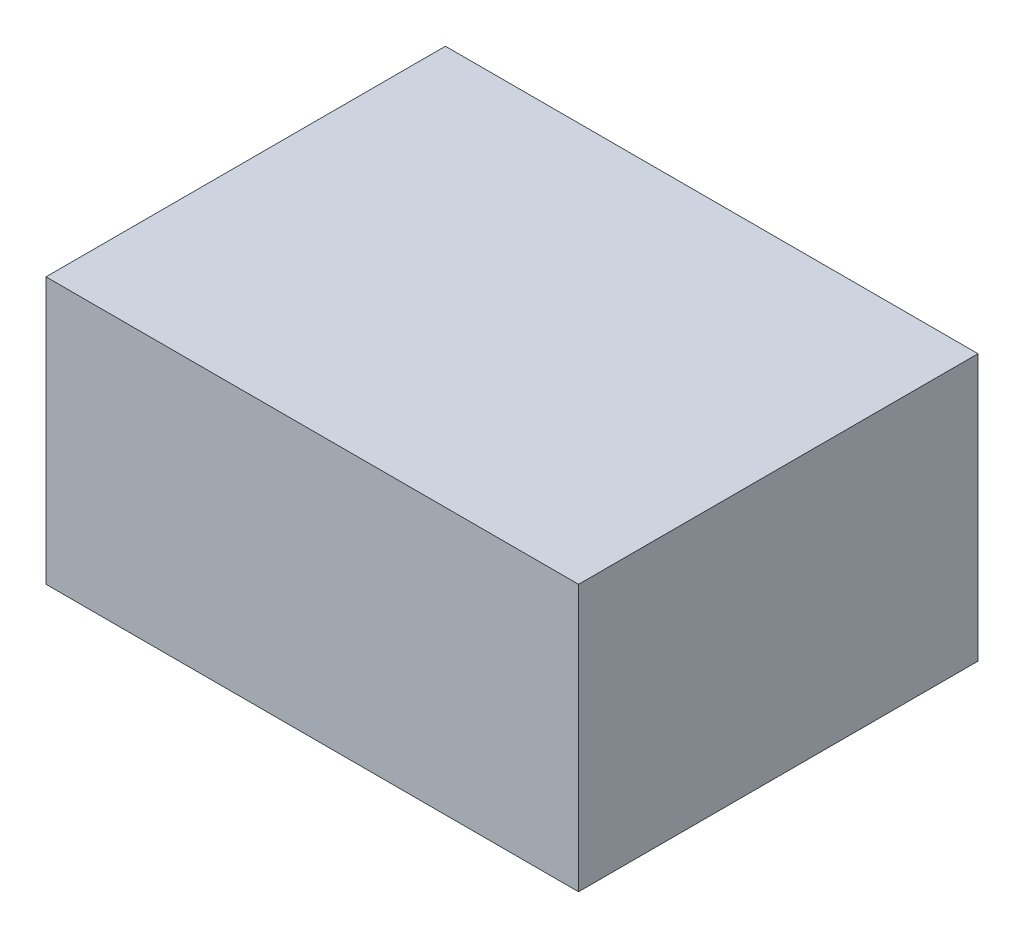
ISO-10303-21;
HEADER;
FILE_DESCRIPTION(('STEP AP214'),'2;1');
FILE_NAME('part.step','',(''),(''),'','','');
FILE_SCHEMA(('AUTOMOTIVE_DESIGN { 1 0 10303 214 1 1 1 1 }'));
ENDSEC;
DATA;
#1=APPLICATION_CONTEXT('core data for automotive mechanical design processes');
#2=APPLICATION_PROTOCOL_DEFINITION('international standard','automotive_design',2000,#1);
#3=PRODUCT_CONTEXT('',#1,'mechanical');
#4=PRODUCT('Part','Part','',(#3));
#5=PRODUCT_RELATED_PRODUCT_CATEGORY('part','',(#4));
#6=PRODUCT_DEFINITION_FORMATION('','',#4);
#7=PRODUCT_DEFINITION_CONTEXT('part definition',#1,'design');
#8=PRODUCT_DEFINITION('design','',#6,#7);
#9=PRODUCT_DEFINITION_SHAPE('','',#8);
#10=(LENGTH_UNIT() NAMED_UNIT(*) SI_UNIT(.MILLI.,.METRE.));
#11=(NAMED_UNIT(*) PLANE_ANGLE_UNIT() SI_UNIT($,.RADIAN.));
#12=(NAMED_UNIT(*) SI_UNIT($,.STERADIAN.) SOLID_ANGLE_UNIT());
#13=UNCERTAINTY_MEASURE_WITH_UNIT(LENGTH_MEASURE(1.E-05),#10,'distance_accuracy_value','');
#14=(GEOMETRIC_REPRESENTATION_CONTEXT(3) GLOBAL_UNCERTAINTY_ASSIGNED_CONTEXT((#13)) GLOBAL_UNIT_ASSIGNED_CONTEXT((#10,
#11,#12)) REPRESENTATION_CONTEXT('',''));
#15=CARTESIAN_POINT('',(0.,0.,0.));
#16=DIRECTION('',(0.,0.,1.));
#17=DIRECTION('',(1.,0.,0.));
#18=AXIS2_PLACEMENT_3D('',#15,#16,#17);
#19=CARTESIAN_POINT('',(-60.,30.,-45.));
#20=DIRECTION('',(1.,0.,0.));
#21=DIRECTION('',(0.,0.,-1.));
#22=AXIS2_PLACEMENT_3D('',#19,#20,#21);
#23=PLANE('',#22);
#24=DIRECTION('',(0.,0.,1.));
#25=VECTOR('',#24,1.);
#26=CARTESIAN_POINT('',(-60.,0.,-45.));
#27=LINE('',#26,#25);
#28=CARTESIAN_POINT('',(-60.,0.,-45.));
#29=VERTEX_POINT('',#28);
#30=CARTESIAN_POINT('',(-60.,0.,0.));
#31=VERTEX_POINT('',#30);
#32=EDGE_CURVE('E243',#29,#31,#27,.T.);
#33=ORIENTED_EDGE('',*,*,#32,.T.);
#34=DIRECTION('',(0.,-1.,0.));
#35=VECTOR('',#34,1.);
#36=CARTESIAN_POINT('',(-60.,30.,0.));
#37=LINE('',#36,#35);
#38=CARTESIAN_POINT('',(-60.,30.,0.));
#39=VERTEX_POINT('',#38);
#40=EDGE_CURVE('E308',#39,#31,#37,.T.);
#41=ORIENTED_EDGE('',*,*,#40,.F.);
#42=DIRECTION('',(0.,0.,1.));
#43=VECTOR('',#42,1.);
#44=CARTESIAN_POINT('',(-60.,30.,-45.));
#45=LINE('',#44,#43);
#46=CARTESIAN_POINT('',(-60.,30.,-45.));
#47=VERTEX_POINT('',#46);
#48=EDGE_CURVE('E270',#47,#39,#45,.T.);
#49=ORIENTED_EDGE('',*,*,#48,.F.);
#50=DIRECTION('',(0.,-1.,0.));
#51=VECTOR('',#50,1.);
#52=CARTESIAN_POINT('',(-60.,30.,-45.));
#53=LINE('',#52,#51);
#54=EDGE_CURVE('E284',#47,#29,#53,.T.);
#55=ORIENTED_EDGE('',*,*,#54,.T.);
#56=EDGE_LOOP('',(#33,#41,#49,#55));
#57=FACE_BOUND('',#56,.T.);
#58=ADVANCED_FACE('F38',(#57),#23,.F.);
#59=CARTESIAN_POINT('',(-60.,30.,0.));
#60=DIRECTION('',(0.,0.,-1.));
#61=DIRECTION('',(-1.,0.,0.));
#62=AXIS2_PLACEMENT_3D('',#59,#60,#61);
#63=PLANE('',#62);
#64=DIRECTION('',(1.,0.,0.));
#65=VECTOR('',#64,1.);
#66=CARTESIAN_POINT('',(-60.,0.,0.));
#67=LINE('',#66,#65);
#68=CARTESIAN_POINT('',(0.,0.,0.));
#69=VERTEX_POINT('',#68);
#70=EDGE_CURVE('E288',#31,#69,#67,.T.);
#71=ORIENTED_EDGE('',*,*,#70,.T.);
#72=DIRECTION('',(0.,-1.,0.));
#73=VECTOR('',#72,1.);
#74=CARTESIAN_POINT('',(0.,30.,0.));
#75=LINE('',#74,#73);
#76=CARTESIAN_POINT('',(0.,30.,0.));
#77=VERTEX_POINT('',#76);
#78=EDGE_CURVE('E304',#77,#69,#75,.T.);
#79=ORIENTED_EDGE('',*,*,#78,.F.);
#80=DIRECTION('',(1.,0.,0.));
#81=VECTOR('',#80,1.);
#82=CARTESIAN_POINT('',(-60.,30.,0.));
#83=LINE('',#82,#81);
#84=EDGE_CURVE('E274',#39,#77,#83,.T.);
#85=ORIENTED_EDGE('',*,*,#84,.F.);
#86=ORIENTED_EDGE('',*,*,#40,.T.);
#87=EDGE_LOOP('',(#71,#79,#85,#86));
#88=FACE_BOUND('',#87,.T.);
#89=ADVANCED_FACE('F525',(#88),#63,.F.);
#90=CARTESIAN_POINT('',(0.,30.,-45.));
#91=DIRECTION('',(-1.,0.,0.));
#92=DIRECTION('',(0.,0.,1.));
#93=AXIS2_PLACEMENT_3D('',#90,#91,#92);
#94=PLANE('',#93);
#95=DIRECTION('',(0.,0.,-1.));
#96=VECTOR('',#95,1.);
#97=CARTESIAN_POINT('',(0.,0.,-45.));
#98=LINE('',#97,#96);
#99=CARTESIAN_POINT('',(0.,0.,-45.));
#100=VERTEX_POINT('',#99);
#101=EDGE_CURVE('E291',#69,#100,#98,.T.);
#102=ORIENTED_EDGE('',*,*,#101,.T.);
#103=DIRECTION('',(0.,-1.,0.));
#104=VECTOR('',#103,1.);
#105=CARTESIAN_POINT('',(0.,30.,-45.));
#106=LINE('',#105,#104);
#107=CARTESIAN_POINT('',(0.,30.,-45.));
#108=VERTEX_POINT('',#107);
#109=EDGE_CURVE('E300',#108,#100,#106,.T.);
#110=ORIENTED_EDGE('',*,*,#109,.F.);
#111=DIRECTION('',(0.,0.,-1.));
#112=VECTOR('',#111,1.);
#113=CARTESIAN_POINT('',(0.,30.,-45.));
#114=LINE('',#113,#112);
#115=EDGE_CURVE('E278',#77,#108,#114,.T.);
#116=ORIENTED_EDGE('',*,*,#115,.F.);
#117=ORIENTED_EDGE('',*,*,#78,.T.);
#118=EDGE_LOOP('',(#102,#110,#116,#117));
#119=FACE_BOUND('',#118,.T.);
#120=ADVANCED_FACE('F531',(#119),#94,.F.);
#121=CARTESIAN_POINT('',(-60.,30.,-45.));
#122=DIRECTION('',(0.,0.,1.));
#123=DIRECTION('',(1.,0.,0.));
#124=AXIS2_PLACEMENT_3D('',#121,#122,#123);
#125=PLANE('',#124);
#126=DIRECTION('',(-1.,0.,0.));
#127=VECTOR('',#126,1.);
#128=CARTESIAN_POINT('',(-60.,0.,-45.));
#129=LINE('',#128,#127);
#130=CARTESIAN_POINT('',(-12.7,0.,-45.));
#131=VERTEX_POINT('',#130);
#132=EDGE_CURVE('E275',#100,#131,#129,.T.);
#133=ORIENTED_EDGE('',*,*,#132,.T.);
#134=CARTESIAN_POINT('',(-34.0331381050122,-5.37561332244758,-45.));
#135=DIRECTION('',(0.,0.,-1.));
#136=DIRECTION('',(-1.,0.,0.));
#137=AXIS2_PLACEMENT_3D('',#134,#135,#136);
#138=CIRCLE('',#137,22.);
#139=CARTESIAN_POINT('',(-47.430644896312,12.0745102237361,-45.));
#140=VERTEX_POINT('',#139);
#141=EDGE_CURVE('E457',#140,#131,#138,.T.);
#142=ORIENTED_EDGE('',*,*,#141,.F.);
#143=CARTESIAN_POINT('',(-45.2992233613325,9.29835420502508,-45.));
#144=DIRECTION('',(0.,0.,-1.));
#145=DIRECTION('',(-1.,0.,0.));
#146=AXIS2_PLACEMENT_3D('',#143,#144,#145);
#147=CIRCLE('',#146,3.5);
#148=CARTESIAN_POINT('',(-43.8119129602392,6.13008846951621,-45.));
#149=VERTEX_POINT('',#148);
#150=EDGE_CURVE('E824',#149,#140,#147,.T.);
#151=ORIENTED_EDGE('',*,*,#150,.F.);
#152=CARTESIAN_POINT('',(-39.383580329191,-3.30313712352215,-45.));
#153=DIRECTION('',(0.,0.,1.));
#154=DIRECTION('',(1.,0.,0.));
#155=AXIS2_PLACEMENT_3D('',#152,#153,#154);
#156=CIRCLE('',#155,10.4209344581165);
#157=CARTESIAN_POINT('',(-29.5,0.,-45.));
#158=VERTEX_POINT('',#157);
#159=EDGE_CURVE('E821',#158,#149,#156,.T.);
#160=ORIENTED_EDGE('',*,*,#159,.F.);
#161=EDGE_CURVE('E229',#158,#29,#129,.T.);
#162=ORIENTED_EDGE('',*,*,#161,.T.);
#163=ORIENTED_EDGE('',*,*,#54,.F.);
#164=DIRECTION('',(-1.,0.,0.));
#165=VECTOR('',#164,1.);
#166=CARTESIAN_POINT('',(-60.,30.,-45.));
#167=LINE('',#166,#165);
#168=EDGE_CURVE('E281',#108,#47,#167,.T.);
#169=ORIENTED_EDGE('',*,*,#168,.F.);
#170=ORIENTED_EDGE('',*,*,#109,.T.);
#171=EDGE_LOOP('',(#133,#142,#151,#160,#162,#163,#169,#170));
#172=FACE_BOUND('',#171,.T.);
#173=ADVANCED_FACE('F749',(#172),#125,.F.);
#174=CARTESIAN_POINT('',(0.,30.,0.));
#175=DIRECTION('',(0.,1.,0.));
#176=DIRECTION('',(0.,0.,1.));
#177=AXIS2_PLACEMENT_3D('',#174,#175,#176);
#178=PLANE('',#177);
#179=ORIENTED_EDGE('',*,*,#48,.T.);
#180=ORIENTED_EDGE('',*,*,#84,.T.);
#181=ORIENTED_EDGE('',*,*,#115,.T.);
#182=ORIENTED_EDGE('',*,*,#168,.T.);
#183=EDGE_LOOP('',(#179,#180,#181,#182));
#184=FACE_BOUND('',#183,.T.);
#185=ADVANCED_FACE('F738',(#184),#178,.T.);
#186=CARTESIAN_POINT('',(0.,0.,0.));
#187=DIRECTION('',(0.,1.,0.));
#188=DIRECTION('',(0.,0.,1.));
#189=AXIS2_PLACEMENT_3D('',#186,#187,#188);
#190=PLANE('',#189);
#191=DIRECTION('',(0.,0.,1.));
#192=VECTOR('',#191,1.);
#193=CARTESIAN_POINT('',(-19.,0.,0.));
#194=LINE('',#193,#192);
#195=CARTESIAN_POINT('',(-19.,0.,-32.));
#196=VERTEX_POINT('',#195);
#197=CARTESIAN_POINT('',(-19.,0.,-9.99999999999998));
#198=VERTEX_POINT('',#197);
#199=EDGE_CURVE('E413',#196,#198,#194,.T.);
#200=ORIENTED_EDGE('',*,*,#199,.T.);
#201=DIRECTION('',(1.,0.,0.));
#202=VECTOR('',#201,1.);
#203=CARTESIAN_POINT('',(0.,0.,-9.99999999999998));
#204=LINE('',#203,#202);
#205=CARTESIAN_POINT('',(-6.49999999999999,0.,-9.99999999999998));
#206=VERTEX_POINT('',#205);
#207=EDGE_CURVE('E422',#198,#206,#204,.T.);
#208=ORIENTED_EDGE('',*,*,#207,.T.);
#209=DIRECTION('',(0.,0.,-1.));
#210=VECTOR('',#209,1.);
#211=CARTESIAN_POINT('',(-6.49999999999999,0.,0.));
#212=LINE('',#211,#210);
#213=CARTESIAN_POINT('',(-6.49999999999998,0.,-32.));
#214=VERTEX_POINT('',#213);
#215=EDGE_CURVE('E419',#206,#214,#212,.T.);
#216=ORIENTED_EDGE('',*,*,#215,.T.);
#217=DIRECTION('',(-1.,0.,0.));
#218=VECTOR('',#217,1.);
#219=CARTESIAN_POINT('',(0.,0.,-32.));
#220=LINE('',#219,#218);
#221=EDGE_CURVE('E416',#214,#196,#220,.T.);
#222=ORIENTED_EDGE('',*,*,#221,.T.);
#223=EDGE_LOOP('',(#200,#208,#216,#222));
#224=FACE_BOUND('',#223,.T.);
#225=DIRECTION('',(0.,0.,-1.));
#226=VECTOR('',#225,1.);
#227=CARTESIAN_POINT('',(-41.5,0.,0.));
#228=LINE('',#227,#226);
#229=CARTESIAN_POINT('',(-41.5,0.,-9.99999999999999));
#230=VERTEX_POINT('',#229);
#231=CARTESIAN_POINT('',(-41.5,0.,-32.));
#232=VERTEX_POINT('',#231);
#233=EDGE_CURVE('E406',#230,#232,#228,.T.);
#234=ORIENTED_EDGE('',*,*,#233,.T.);
#235=DIRECTION('',(-1.,0.,0.));
#236=VECTOR('',#235,1.);
#237=CARTESIAN_POINT('',(0.,0.,-32.0000000000001));
#238=LINE('',#237,#236);
#239=CARTESIAN_POINT('',(-54.,0.,-32.));
#240=VERTEX_POINT('',#239);
#241=EDGE_CURVE('E409',#232,#240,#238,.T.);
#242=ORIENTED_EDGE('',*,*,#241,.T.);
#243=DIRECTION('',(0.,0.,1.));
#244=VECTOR('',#243,1.);
#245=CARTESIAN_POINT('',(-54.,0.,0.));
#246=LINE('',#245,#244);
#247=CARTESIAN_POINT('',(-54.,0.,-9.99999999999997));
#248=VERTEX_POINT('',#247);
#249=EDGE_CURVE('E400',#240,#248,#246,.T.);
#250=ORIENTED_EDGE('',*,*,#249,.T.);
#251=DIRECTION('',(1.,0.,0.));
#252=VECTOR('',#251,1.);
#253=CARTESIAN_POINT('',(0.,0.,-10.0000000000001));
#254=LINE('',#253,#252);
#255=EDGE_CURVE('E403',#248,#230,#254,.T.);
#256=ORIENTED_EDGE('',*,*,#255,.T.);
#257=EDGE_LOOP('',(#234,#242,#250,#256));
#258=FACE_BOUND('',#257,.T.);
#259=DIRECTION('',(-1.,0.,0.));
#260=VECTOR('',#259,1.);
#261=CARTESIAN_POINT('',(-12.7,0.,-35.));
#262=LINE('',#261,#260);
#263=CARTESIAN_POINT('',(-12.7,0.,-35.));
#264=VERTEX_POINT('',#263);
#265=CARTESIAN_POINT('',(-29.5,0.,-35.));
#266=VERTEX_POINT('',#265);
#267=EDGE_CURVE('E215',#264,#266,#262,.T.);
#268=ORIENTED_EDGE('',*,*,#267,.F.);
#269=DIRECTION('',(0.,0.,-1.));
#270=VECTOR('',#269,1.);
#271=CARTESIAN_POINT('',(-12.7,0.,-35.));
#272=LINE('',#271,#270);
#273=EDGE_CURVE('E231',#264,#131,#272,.T.);
#274=ORIENTED_EDGE('',*,*,#273,.T.);
#275=ORIENTED_EDGE('',*,*,#132,.F.);
#276=ORIENTED_EDGE('',*,*,#101,.F.);
#277=ORIENTED_EDGE('',*,*,#70,.F.);
#278=ORIENTED_EDGE('',*,*,#32,.F.);
#279=ORIENTED_EDGE('',*,*,#161,.F.);
#280=DIRECTION('',(0.,0.,-1.));
#281=VECTOR('',#280,1.);
#282=CARTESIAN_POINT('',(-29.5,0.,-35.));
#283=LINE('',#282,#281);
#284=EDGE_CURVE('E207',#266,#158,#283,.T.);
#285=ORIENTED_EDGE('',*,*,#284,.F.);
#286=EDGE_LOOP('',(#268,#274,#275,#276,#277,#278,#279,#285));
#287=FACE_BOUND('',#286,.T.);
#288=ADVANCED_FACE('F227',(#224,#258,#287),#190,.F.);
#289=CARTESIAN_POINT('',(-16.,20.,-13.));
#290=DIRECTION('',(-1.,0.,0.));
#291=DIRECTION('',(0.,0.,1.));
#292=AXIS2_PLACEMENT_3D('',#289,#290,#291);
#293=PLANE('',#292);
#294=DIRECTION('',(0.,-1.,0.));
#295=VECTOR('',#294,1.);
#296=CARTESIAN_POINT('',(-16.,20.,-13.));
#297=LINE('',#296,#295);
#298=CARTESIAN_POINT('',(-16.,15.0000000000002,-13.));
#299=VERTEX_POINT('',#298);
#300=CARTESIAN_POINT('',(-16.,1.99999999999999,-13.));
#301=VERTEX_POINT('',#300);
#302=EDGE_CURVE('E254',#299,#301,#297,.T.);
#303=ORIENTED_EDGE('',*,*,#302,.T.);
#304=DIRECTION('',(0.,0.,-1.));
#305=VECTOR('',#304,1.);
#306=CARTESIAN_POINT('',(-16.,1.99999999999999,-13.));
#307=LINE('',#306,#305);
#308=CARTESIAN_POINT('',(-16.,1.99999999999999,-29.));
#309=VERTEX_POINT('',#308);
#310=EDGE_CURVE('E432',#301,#309,#307,.T.);
#311=ORIENTED_EDGE('',*,*,#310,.T.);
#312=DIRECTION('',(0.,-1.,0.));
#313=VECTOR('',#312,1.);
#314=CARTESIAN_POINT('',(-16.,20.,-29.));
#315=LINE('',#314,#313);
#316=CARTESIAN_POINT('',(-16.,15.0000000000002,-29.));
#317=VERTEX_POINT('',#316);
#318=EDGE_CURVE('E266',#317,#309,#315,.T.);
#319=ORIENTED_EDGE('',*,*,#318,.F.);
#320=DIRECTION('',(0.,0.,1.));
#321=VECTOR('',#320,1.);
#322=CARTESIAN_POINT('',(-16.,15.0000000000002,-13.));
#323=LINE('',#322,#321);
#324=EDGE_CURVE('E320',#317,#299,#323,.T.);
#325=ORIENTED_EDGE('',*,*,#324,.T.);
#326=EDGE_LOOP('',(#303,#311,#319,#325));
#327=FACE_BOUND('',#326,.T.);
#328=ADVANCED_FACE('F721',(#327),#293,.F.);
#329=CARTESIAN_POINT('',(-16.,20.,-13.));
#330=DIRECTION('',(0.,0.,1.));
#331=DIRECTION('',(1.,0.,0.));
#332=AXIS2_PLACEMENT_3D('',#329,#330,#331);
#333=PLANE('',#332);
#334=DIRECTION('',(0.,-1.,0.));
#335=VECTOR('',#334,1.);
#336=CARTESIAN_POINT('',(-9.5,20.,-13.));
#337=LINE('',#336,#335);
#338=CARTESIAN_POINT('',(-9.5,15.0000000000002,-13.));
#339=VERTEX_POINT('',#338);
#340=CARTESIAN_POINT('',(-9.5,1.99999999999999,-13.));
#341=VERTEX_POINT('',#340);
#342=EDGE_CURVE('E258',#339,#341,#337,.T.);
#343=ORIENTED_EDGE('',*,*,#342,.T.);
#344=DIRECTION('',(-1.,0.,0.));
#345=VECTOR('',#344,1.);
#346=CARTESIAN_POINT('',(-16.,1.99999999999999,-13.));
#347=LINE('',#346,#345);
#348=EDGE_CURVE('E396',#341,#301,#347,.T.);
#349=ORIENTED_EDGE('',*,*,#348,.T.);
#350=ORIENTED_EDGE('',*,*,#302,.F.);
#351=DIRECTION('',(1.,0.,0.));
#352=VECTOR('',#351,1.);
#353=CARTESIAN_POINT('',(-16.,15.,-13.));
#354=LINE('',#353,#352);
#355=EDGE_CURVE('E390',#299,#339,#354,.T.);
#356=ORIENTED_EDGE('',*,*,#355,.T.);
#357=EDGE_LOOP('',(#343,#349,#350,#356));
#358=FACE_BOUND('',#357,.T.);
#359=ADVANCED_FACE('F711',(#358),#333,.F.);
#360=CARTESIAN_POINT('',(-9.5,20.,-13.));
#361=DIRECTION('',(1.,0.,0.));
#362=DIRECTION('',(0.,0.,-1.));
#363=AXIS2_PLACEMENT_3D('',#360,#361,#362);
#364=PLANE('',#363);
#365=DIRECTION('',(0.,-1.,0.));
#366=VECTOR('',#365,1.);
#367=CARTESIAN_POINT('',(-9.5,20.,-29.));
#368=LINE('',#367,#366);
#369=CARTESIAN_POINT('',(-9.5,15.0000000000002,-29.));
#370=VERTEX_POINT('',#369);
#371=CARTESIAN_POINT('',(-9.5,1.99999999999999,-29.));
#372=VERTEX_POINT('',#371);
#373=EDGE_CURVE('E262',#370,#372,#368,.T.);
#374=ORIENTED_EDGE('',*,*,#373,.T.);
#375=DIRECTION('',(0.,0.,1.));
#376=VECTOR('',#375,1.);
#377=CARTESIAN_POINT('',(-9.5,1.99999999999999,-13.));
#378=LINE('',#377,#376);
#379=EDGE_CURVE('E426',#372,#341,#378,.T.);
#380=ORIENTED_EDGE('',*,*,#379,.T.);
#381=ORIENTED_EDGE('',*,*,#342,.F.);
#382=DIRECTION('',(0.,0.,-1.));
#383=VECTOR('',#382,1.);
#384=CARTESIAN_POINT('',(-9.5,15.0000000000002,-13.));
#385=LINE('',#384,#383);
#386=EDGE_CURVE('E324',#339,#370,#385,.T.);
#387=ORIENTED_EDGE('',*,*,#386,.T.);
#388=EDGE_LOOP('',(#374,#380,#381,#387));
#389=FACE_BOUND('',#388,.T.);
#390=ADVANCED_FACE('F701',(#389),#364,.F.);
#391=CARTESIAN_POINT('',(-16.,20.,-29.));
#392=DIRECTION('',(0.,0.,-1.));
#393=DIRECTION('',(-1.,0.,0.));
#394=AXIS2_PLACEMENT_3D('',#391,#392,#393);
#395=PLANE('',#394);
#396=ORIENTED_EDGE('',*,*,#318,.T.);
#397=DIRECTION('',(1.,0.,0.));
#398=VECTOR('',#397,1.);
#399=CARTESIAN_POINT('',(-16.,1.99999999999999,-29.));
#400=LINE('',#399,#398);
#401=EDGE_CURVE('E429',#309,#372,#400,.T.);
#402=ORIENTED_EDGE('',*,*,#401,.T.);
#403=ORIENTED_EDGE('',*,*,#373,.F.);
#404=DIRECTION('',(-1.,0.,0.));
#405=VECTOR('',#404,1.);
#406=CARTESIAN_POINT('',(-16.,15.,-29.));
#407=LINE('',#406,#405);
#408=EDGE_CURVE('E381',#370,#317,#407,.T.);
#409=ORIENTED_EDGE('',*,*,#408,.T.);
#410=EDGE_LOOP('',(#396,#402,#403,#409));
#411=FACE_BOUND('',#410,.T.);
#412=ADVANCED_FACE('F696',(#411),#395,.F.);
#413=CARTESIAN_POINT('',(0.,20.,0.));
#414=DIRECTION('',(0.,-1.,0.));
#415=DIRECTION('',(0.,0.,-1.));
#416=AXIS2_PLACEMENT_3D('',#413,#414,#415);
#417=PLANE('',#416);
#418=DIRECTION('',(0.,0.,-1.));
#419=VECTOR('',#418,1.);
#420=CARTESIAN_POINT('',(-15.5625566823704,20.,0.));
#421=LINE('',#420,#419);
#422=CARTESIAN_POINT('',(-15.5625566823704,20.,-18.9587679629711));
#423=VERTEX_POINT('',#422);
#424=CARTESIAN_POINT('',(-15.5625566823704,20.,-23.0412320370289));
#425=VERTEX_POINT('',#424);
#426=EDGE_CURVE('E316',#423,#425,#421,.T.);
#427=ORIENTED_EDGE('',*,*,#426,.T.);
#428=DIRECTION('',(1.,0.,0.));
#429=VECTOR('',#428,1.);
#430=CARTESIAN_POINT('',(0.,20.,-23.0412320370289));
#431=LINE('',#430,#429);
#432=CARTESIAN_POINT('',(-9.93744331762962,20.,-23.0412320370289));
#433=VERTEX_POINT('',#432);
#434=EDGE_CURVE('E371',#425,#433,#431,.T.);
#435=ORIENTED_EDGE('',*,*,#434,.T.);
#436=DIRECTION('',(0.,0.,1.));
#437=VECTOR('',#436,1.);
#438=CARTESIAN_POINT('',(-9.93744331762963,20.,0.));
#439=LINE('',#438,#437);
#440=CARTESIAN_POINT('',(-9.93744331762962,20.,-18.9587679629711));
#441=VERTEX_POINT('',#440);
#442=EDGE_CURVE('E312',#433,#441,#439,.T.);
#443=ORIENTED_EDGE('',*,*,#442,.T.);
#444=DIRECTION('',(-1.,0.,0.));
#445=VECTOR('',#444,1.);
#446=CARTESIAN_POINT('',(0.,20.,-18.9587679629711));
#447=LINE('',#446,#445);
#448=EDGE_CURVE('E367',#441,#423,#447,.T.);
#449=ORIENTED_EDGE('',*,*,#448,.T.);
#450=EDGE_LOOP('',(#427,#435,#443,#449));
#451=FACE_BOUND('',#450,.T.);
#452=ADVANCED_FACE('F521',(#451),#417,.T.);
#453=CARTESIAN_POINT('',(-51.,20.,-13.));
#454=DIRECTION('',(-1.,0.,0.));
#455=DIRECTION('',(0.,0.,1.));
#456=AXIS2_PLACEMENT_3D('',#453,#454,#455);
#457=PLANE('',#456);
#458=DIRECTION('',(0.,-1.,0.));
#459=VECTOR('',#458,1.);
#460=CARTESIAN_POINT('',(-51.,20.,-13.));
#461=LINE('',#460,#459);
#462=CARTESIAN_POINT('',(-51.,15.0000000000002,-13.));
#463=VERTEX_POINT('',#462);
#464=CARTESIAN_POINT('',(-51.,1.99999999999999,-13.));
#465=VERTEX_POINT('',#464);
#466=EDGE_CURVE('E240',#463,#465,#461,.T.);
#467=ORIENTED_EDGE('',*,*,#466,.T.);
#468=DIRECTION('',(0.,0.,-1.));
#469=VECTOR('',#468,1.);
#470=CARTESIAN_POINT('',(-51.,1.99999999999999,-13.));
#471=LINE('',#470,#469);
#472=CARTESIAN_POINT('',(-51.,1.99999999999999,-29.));
#473=VERTEX_POINT('',#472);
#474=EDGE_CURVE('E11',#465,#473,#471,.T.);
#475=ORIENTED_EDGE('',*,*,#474,.T.);
#476=DIRECTION('',(0.,-1.,0.));
#477=VECTOR('',#476,1.);
#478=CARTESIAN_POINT('',(-51.,20.,-29.));
#479=LINE('',#478,#477);
#480=CARTESIAN_POINT('',(-51.,15.0000000000002,-29.));
#481=VERTEX_POINT('',#480);
#482=EDGE_CURVE('E250',#481,#473,#479,.T.);
#483=ORIENTED_EDGE('',*,*,#482,.F.);
#484=DIRECTION('',(0.,0.,1.));
#485=VECTOR('',#484,1.);
#486=CARTESIAN_POINT('',(-51.,15.0000000000002,-13.));
#487=LINE('',#486,#485);
#488=EDGE_CURVE('E336',#481,#463,#487,.T.);
#489=ORIENTED_EDGE('',*,*,#488,.T.);
#490=EDGE_LOOP('',(#467,#475,#483,#489));
#491=FACE_BOUND('',#490,.T.);
#492=ADVANCED_FACE('F512',(#491),#457,.F.);
#493=CARTESIAN_POINT('',(-51.,20.,-13.));
#494=DIRECTION('',(0.,0.,1.));
#495=DIRECTION('',(1.,0.,0.));
#496=AXIS2_PLACEMENT_3D('',#493,#494,#495);
#497=PLANE('',#496);
#498=DIRECTION('',(0.,-1.,0.));
#499=VECTOR('',#498,1.);
#500=CARTESIAN_POINT('',(-44.5,20.,-13.));
#501=LINE('',#500,#499);
#502=CARTESIAN_POINT('',(-44.5,15.0000000000002,-13.));
#503=VERTEX_POINT('',#502);
#504=CARTESIAN_POINT('',(-44.5,1.99999999999999,-13.));
#505=VERTEX_POINT('',#504);
#506=EDGE_CURVE('E244',#503,#505,#501,.T.);
#507=ORIENTED_EDGE('',*,*,#506,.T.);
#508=DIRECTION('',(-1.,0.,0.));
#509=VECTOR('',#508,1.);
#510=CARTESIAN_POINT('',(-51.,1.99999999999999,-13.));
#511=LINE('',#510,#509);
#512=EDGE_CURVE('E48',#505,#465,#511,.T.);
#513=ORIENTED_EDGE('',*,*,#512,.T.);
#514=ORIENTED_EDGE('',*,*,#466,.F.);
#515=DIRECTION('',(1.,0.,0.));
#516=VECTOR('',#515,1.);
#517=CARTESIAN_POINT('',(-51.,15.,-13.));
#518=LINE('',#517,#516);
#519=EDGE_CURVE('E393',#463,#503,#518,.T.);
#520=ORIENTED_EDGE('',*,*,#519,.T.);
#521=EDGE_LOOP('',(#507,#513,#514,#520));
#522=FACE_BOUND('',#521,.T.);
#523=ADVANCED_FACE('F513',(#522),#497,.F.);
#524=CARTESIAN_POINT('',(-44.5,20.,-13.));
#525=DIRECTION('',(1.,0.,0.));
#526=DIRECTION('',(0.,0.,-1.));
#527=AXIS2_PLACEMENT_3D('',#524,#525,#526);
#528=PLANE('',#527);
#529=DIRECTION('',(0.,-1.,0.));
#530=VECTOR('',#529,1.);
#531=CARTESIAN_POINT('',(-44.5,20.,-29.));
#532=LINE('',#531,#530);
#533=CARTESIAN_POINT('',(-44.5,15.0000000000002,-29.));
#534=VERTEX_POINT('',#533);
#535=CARTESIAN_POINT('',(-44.5,1.99999999999999,-29.));
#536=VERTEX_POINT('',#535);
#537=EDGE_CURVE('E247',#534,#536,#532,.T.);
#538=ORIENTED_EDGE('',*,*,#537,.T.);
#539=DIRECTION('',(0.,0.,1.));
#540=VECTOR('',#539,1.);
#541=CARTESIAN_POINT('',(-44.5,1.99999999999999,-13.));
#542=LINE('',#541,#540);
#543=EDGE_CURVE('E63',#536,#505,#542,.T.);
#544=ORIENTED_EDGE('',*,*,#543,.T.);
#545=ORIENTED_EDGE('',*,*,#506,.F.);
#546=DIRECTION('',(0.,0.,-1.));
#547=VECTOR('',#546,1.);
#548=CARTESIAN_POINT('',(-44.5,15.0000000000002,-13.));
#549=LINE('',#548,#547);
#550=EDGE_CURVE('E340',#503,#534,#549,.T.);
#551=ORIENTED_EDGE('',*,*,#550,.T.);
#552=EDGE_LOOP('',(#538,#544,#545,#551));
#553=FACE_BOUND('',#552,.T.);
#554=ADVANCED_FACE('F491',(#553),#528,.F.);
#555=CARTESIAN_POINT('',(-51.,20.,-29.));
#556=DIRECTION('',(0.,0.,-1.));
#557=DIRECTION('',(-1.,0.,0.));
#558=AXIS2_PLACEMENT_3D('',#555,#556,#557);
#559=PLANE('',#558);
#560=ORIENTED_EDGE('',*,*,#482,.T.);
#561=DIRECTION('',(1.,0.,0.));
#562=VECTOR('',#561,1.);
#563=CARTESIAN_POINT('',(-51.,1.99999999999999,-29.));
#564=LINE('',#563,#562);
#565=EDGE_CURVE('E435',#473,#536,#564,.T.);
#566=ORIENTED_EDGE('',*,*,#565,.T.);
#567=ORIENTED_EDGE('',*,*,#537,.F.);
#568=DIRECTION('',(-1.,0.,0.));
#569=VECTOR('',#568,1.);
#570=CARTESIAN_POINT('',(-51.,15.,-29.));
#571=LINE('',#570,#569);
#572=EDGE_CURVE('E358',#534,#481,#571,.T.);
#573=ORIENTED_EDGE('',*,*,#572,.T.);
#574=EDGE_LOOP('',(#560,#566,#567,#573));
#575=FACE_BOUND('',#574,.T.);
#576=ADVANCED_FACE('F488',(#575),#559,.F.);
#577=CARTESIAN_POINT('',(0.,20.,0.));
#578=DIRECTION('',(0.,-1.,0.));
#579=DIRECTION('',(0.,0.,-1.));
#580=AXIS2_PLACEMENT_3D('',#577,#578,#579);
#581=PLANE('',#580);
#582=DIRECTION('',(0.,0.,-1.));
#583=VECTOR('',#582,1.);
#584=CARTESIAN_POINT('',(-50.5625566823704,20.,0.));
#585=LINE('',#584,#583);
#586=CARTESIAN_POINT('',(-50.5625566823704,20.,-18.9587679629711));
#587=VERTEX_POINT('',#586);
#588=CARTESIAN_POINT('',(-50.5625566823704,20.,-23.0412320370289));
#589=VERTEX_POINT('',#588);
#590=EDGE_CURVE('E332',#587,#589,#585,.T.);
#591=ORIENTED_EDGE('',*,*,#590,.T.);
#592=DIRECTION('',(1.,0.,0.));
#593=VECTOR('',#592,1.);
#594=CARTESIAN_POINT('',(0.,20.,-23.0412320370289));
#595=LINE('',#594,#593);
#596=CARTESIAN_POINT('',(-44.9374433176296,20.,-23.0412320370289));
#597=VERTEX_POINT('',#596);
#598=EDGE_CURVE('E348',#589,#597,#595,.T.);
#599=ORIENTED_EDGE('',*,*,#598,.T.);
#600=DIRECTION('',(0.,0.,1.));
#601=VECTOR('',#600,1.);
#602=CARTESIAN_POINT('',(-44.9374433176296,20.,0.));
#603=LINE('',#602,#601);
#604=CARTESIAN_POINT('',(-44.9374433176296,20.,-18.9587679629711));
#605=VERTEX_POINT('',#604);
#606=EDGE_CURVE('E328',#597,#605,#603,.T.);
#607=ORIENTED_EDGE('',*,*,#606,.T.);
#608=DIRECTION('',(-1.,0.,0.));
#609=VECTOR('',#608,1.);
#610=CARTESIAN_POINT('',(0.,20.,-18.9587679629712));
#611=LINE('',#610,#609);
#612=EDGE_CURVE('E344',#605,#587,#611,.T.);
#613=ORIENTED_EDGE('',*,*,#612,.T.);
#614=EDGE_LOOP('',(#591,#599,#607,#613));
#615=FACE_BOUND('',#614,.T.);
#616=ADVANCED_FACE('F503',(#615),#581,.T.);
#617=CARTESIAN_POINT('',(-15.5625566823704,20.,0.));
#618=DIRECTION('',(-0.996194698091745,0.0871557427476621,0.));
#619=DIRECTION('',(0.,0.,-1.));
#620=AXIS2_PLACEMENT_3D('',#617,#618,#619);
#621=PLANE('',#620);
#622=ORIENTED_EDGE('',*,*,#324,.F.);
#623=DIRECTION('',(0.0561479134605438,0.641773587544905,0.764835978588723));
#624=VECTOR('',#623,1.);
#625=CARTESIAN_POINT('',(-15.51349435003,20.5607850247459,-22.3729144691149));
#626=LINE('',#625,#624);
#627=EDGE_CURVE('E387',#317,#425,#626,.T.);
#628=ORIENTED_EDGE('',*,*,#627,.T.);
#629=ORIENTED_EDGE('',*,*,#426,.F.);
#630=DIRECTION('',(-0.0561479134605438,-0.641773587544905,0.764835978588723));
#631=VECTOR('',#630,1.);
#632=CARTESIAN_POINT('',(-15.51349435003,20.5607850247459,-19.6270855308851));
#633=LINE('',#632,#631);
#634=EDGE_CURVE('E384',#423,#299,#633,.T.);
#635=ORIENTED_EDGE('',*,*,#634,.T.);
#636=EDGE_LOOP('',(#622,#628,#629,#635));
#637=FACE_BOUND('',#636,.T.);
#638=ADVANCED_FACE('F536',(#637),#621,.F.);
#639=CARTESIAN_POINT('',(-9.93744331762963,20.,0.));
#640=DIRECTION('',(0.996194698091745,0.0871557427476619,0.));
#641=DIRECTION('',(0.,0.,1.));
#642=AXIS2_PLACEMENT_3D('',#639,#640,#641);
#643=PLANE('',#642);
#644=ORIENTED_EDGE('',*,*,#442,.F.);
#645=DIRECTION('',(0.0561479134605439,-0.641773587544905,-0.764835978588723));
#646=VECTOR('',#645,1.);
#647=CARTESIAN_POINT('',(-9.90611465122769,19.6419117044502,-23.4679850497164));
#648=LINE('',#647,#646);
#649=EDGE_CURVE('E378',#433,#370,#648,.T.);
#650=ORIENTED_EDGE('',*,*,#649,.T.);
#651=ORIENTED_EDGE('',*,*,#386,.F.);
#652=DIRECTION('',(-0.0561479134605435,0.641773587544905,-0.764835978588723));
#653=VECTOR('',#652,1.);
#654=CARTESIAN_POINT('',(-9.90611465122769,19.6419117044502,-18.5320149502836));
#655=LINE('',#654,#653);
#656=EDGE_CURVE('E375',#339,#441,#655,.T.);
#657=ORIENTED_EDGE('',*,*,#656,.T.);
#658=EDGE_LOOP('',(#644,#650,#651,#657));
#659=FACE_BOUND('',#658,.T.);
#660=ADVANCED_FACE('F539',(#659),#643,.F.);
#661=CARTESIAN_POINT('',(-50.5625566823704,20.,0.));
#662=DIRECTION('',(-0.996194698091745,0.0871557427476608,0.));
#663=DIRECTION('',(0.,0.,-1.));
#664=AXIS2_PLACEMENT_3D('',#661,#662,#663);
#665=PLANE('',#664);
#666=ORIENTED_EDGE('',*,*,#488,.F.);
#667=DIRECTION('',(0.0561479134605433,0.641773587544905,0.764835978588723));
#668=VECTOR('',#667,1.);
#669=CARTESIAN_POINT('',(-50.403153763521,21.8219836996615,-20.8698764173091));
#670=LINE('',#669,#668);
#671=EDGE_CURVE('E364',#481,#589,#670,.T.);
#672=ORIENTED_EDGE('',*,*,#671,.T.);
#673=ORIENTED_EDGE('',*,*,#590,.F.);
#674=DIRECTION('',(-0.0561479134605427,-0.641773587544905,0.764835978588723));
#675=VECTOR('',#674,1.);
#676=CARTESIAN_POINT('',(-50.403153763521,21.8219836996616,-21.1301235826909));
#677=LINE('',#676,#675);
#678=EDGE_CURVE('E361',#587,#463,#677,.T.);
#679=ORIENTED_EDGE('',*,*,#678,.T.);
#680=EDGE_LOOP('',(#666,#672,#673,#679));
#681=FACE_BOUND('',#680,.T.);
#682=ADVANCED_FACE('F507',(#681),#665,.F.);
#683=CARTESIAN_POINT('',(-44.9374433176296,20.,0.));
#684=DIRECTION('',(0.996194698091745,0.0871557427476624,0.));
#685=DIRECTION('',(0.,0.,1.));
#686=AXIS2_PLACEMENT_3D('',#683,#684,#685);
#687=PLANE('',#686);
#688=ORIENTED_EDGE('',*,*,#606,.F.);
#689=DIRECTION('',(0.056147913460544,-0.641773587544905,-0.764835978588723));
#690=VECTOR('',#689,1.);
#691=CARTESIAN_POINT('',(-44.7957740647186,18.3807130295344,-24.9710231015222));
#692=LINE('',#691,#690);
#693=EDGE_CURVE('E355',#597,#534,#692,.T.);
#694=ORIENTED_EDGE('',*,*,#693,.T.);
#695=ORIENTED_EDGE('',*,*,#550,.F.);
#696=DIRECTION('',(-0.056147913460544,0.641773587544905,-0.764835978588723));
#697=VECTOR('',#696,1.);
#698=CARTESIAN_POINT('',(-44.7957740647186,18.3807130295345,-17.0289768984778));
#699=LINE('',#698,#697);
#700=EDGE_CURVE('E352',#503,#605,#699,.T.);
#701=ORIENTED_EDGE('',*,*,#700,.T.);
#702=EDGE_LOOP('',(#688,#694,#695,#701));
#703=FACE_BOUND('',#702,.T.);
#704=ADVANCED_FACE('F496',(#703),#687,.F.);
#705=CARTESIAN_POINT('',(0.,20.,-23.0412320370289));
#706=DIRECTION('',(0.,0.766044443118981,-0.642787609686535));
#707=DIRECTION('',(1.,0.,0.));
#708=AXIS2_PLACEMENT_3D('',#705,#706,#707);
#709=PLANE('',#708);
#710=ORIENTED_EDGE('',*,*,#671,.F.);
#711=ORIENTED_EDGE('',*,*,#572,.F.);
#712=ORIENTED_EDGE('',*,*,#693,.F.);
#713=ORIENTED_EDGE('',*,*,#598,.F.);
#714=EDGE_LOOP('',(#710,#711,#712,#713));
#715=FACE_BOUND('',#714,.T.);
#716=ADVANCED_FACE('F510',(#715),#709,.F.);
#717=CARTESIAN_POINT('',(0.,20.,-23.0412320370289));
#718=DIRECTION('',(0.,0.766044443118981,-0.642787609686535));
#719=DIRECTION('',(1.,0.,0.));
#720=AXIS2_PLACEMENT_3D('',#717,#718,#719);
#721=PLANE('',#720);
#722=ORIENTED_EDGE('',*,*,#627,.F.);
#723=ORIENTED_EDGE('',*,*,#408,.F.);
#724=ORIENTED_EDGE('',*,*,#649,.F.);
#725=ORIENTED_EDGE('',*,*,#434,.F.);
#726=EDGE_LOOP('',(#722,#723,#724,#725));
#727=FACE_BOUND('',#726,.T.);
#728=ADVANCED_FACE('F550',(#727),#721,.F.);
#729=CARTESIAN_POINT('',(0.,20.,-18.9587679629711));
#730=DIRECTION('',(0.,0.766044443118981,0.642787609686535));
#731=DIRECTION('',(-1.,0.,0.));
#732=AXIS2_PLACEMENT_3D('',#729,#730,#731);
#733=PLANE('',#732);
#734=ORIENTED_EDGE('',*,*,#656,.F.);
#735=ORIENTED_EDGE('',*,*,#355,.F.);
#736=ORIENTED_EDGE('',*,*,#634,.F.);
#737=ORIENTED_EDGE('',*,*,#448,.F.);
#738=EDGE_LOOP('',(#734,#735,#736,#737));
#739=FACE_BOUND('',#738,.T.);
#740=ADVANCED_FACE('F553',(#739),#733,.F.);
#741=CARTESIAN_POINT('',(0.,20.,-18.9587679629712));
#742=DIRECTION('',(0.,0.766044443118981,0.642787609686535));
#743=DIRECTION('',(-1.,0.,0.));
#744=AXIS2_PLACEMENT_3D('',#741,#742,#743);
#745=PLANE('',#744);
#746=ORIENTED_EDGE('',*,*,#700,.F.);
#747=ORIENTED_EDGE('',*,*,#519,.F.);
#748=ORIENTED_EDGE('',*,*,#678,.F.);
#749=ORIENTED_EDGE('',*,*,#612,.F.);
#750=EDGE_LOOP('',(#746,#747,#748,#749));
#751=FACE_BOUND('',#750,.T.);
#752=ADVANCED_FACE('F500',(#751),#745,.F.);
#753=CARTESIAN_POINT('',(-34.0331381050122,-5.37561332244758,-35.));
#754=DIRECTION('',(0.,0.,-1.));
#755=DIRECTION('',(-1.,0.,0.));
#756=AXIS2_PLACEMENT_3D('',#753,#754,#755);
#757=CYLINDRICAL_SURFACE('',#756,22.);
#758=ORIENTED_EDGE('',*,*,#141,.T.);
#759=ORIENTED_EDGE('',*,*,#273,.F.);
#760=CARTESIAN_POINT('',(-34.0331381050122,-5.37561332244758,-35.));
#761=DIRECTION('',(0.,0.,-1.));
#762=DIRECTION('',(-1.,0.,0.));
#763=AXIS2_PLACEMENT_3D('',#760,#761,#762);
#764=CIRCLE('',#763,22.);
#765=CARTESIAN_POINT('',(-47.430644896312,12.0745102237361,-35.));
#766=VERTEX_POINT('',#765);
#767=EDGE_CURVE('E220',#766,#264,#764,.T.);
#768=ORIENTED_EDGE('',*,*,#767,.F.);
#769=DIRECTION('',(0.,0.,-1.));
#770=VECTOR('',#769,1.);
#771=CARTESIAN_POINT('',(-47.430644896312,12.0745102237361,-35.));
#772=LINE('',#771,#770);
#773=EDGE_CURVE('E235',#766,#140,#772,.T.);
#774=ORIENTED_EDGE('',*,*,#773,.T.);
#775=EDGE_LOOP('',(#758,#759,#768,#774));
#776=FACE_BOUND('',#775,.T.);
#777=ADVANCED_FACE('F560',(#776),#757,.F.);
#778=CARTESIAN_POINT('',(-45.2992233613325,9.29835420502508,-35.));
#779=DIRECTION('',(0.,0.,-1.));
#780=DIRECTION('',(-1.,0.,0.));
#781=AXIS2_PLACEMENT_3D('',#778,#779,#780);
#782=CYLINDRICAL_SURFACE('',#781,3.5);
#783=ORIENTED_EDGE('',*,*,#150,.T.);
#784=ORIENTED_EDGE('',*,*,#773,.F.);
#785=CARTESIAN_POINT('',(-45.2992233613325,9.29835420502508,-35.));
#786=DIRECTION('',(0.,0.,-1.));
#787=DIRECTION('',(-1.,0.,0.));
#788=AXIS2_PLACEMENT_3D('',#785,#786,#787);
#789=CIRCLE('',#788,3.5);
#790=CARTESIAN_POINT('',(-43.8119129602392,6.13008846951621,-35.));
#791=VERTEX_POINT('',#790);
#792=EDGE_CURVE('E214',#791,#766,#789,.T.);
#793=ORIENTED_EDGE('',*,*,#792,.F.);
#794=DIRECTION('',(0.,0.,-1.));
#795=VECTOR('',#794,1.);
#796=CARTESIAN_POINT('',(-43.8119129602392,6.13008846951621,-35.));
#797=LINE('',#796,#795);
#798=EDGE_CURVE('E209',#791,#149,#797,.T.);
#799=ORIENTED_EDGE('',*,*,#798,.T.);
#800=EDGE_LOOP('',(#783,#784,#793,#799));
#801=FACE_BOUND('',#800,.T.);
#802=ADVANCED_FACE('F616',(#801),#782,.F.);
#803=CARTESIAN_POINT('',(-39.383580329191,-3.30313712352215,-35.));
#804=DIRECTION('',(0.,0.,-1.));
#805=DIRECTION('',(-1.,0.,0.));
#806=AXIS2_PLACEMENT_3D('',#803,#804,#805);
#807=CYLINDRICAL_SURFACE('',#806,10.4209344581165);
#808=ORIENTED_EDGE('',*,*,#159,.T.);
#809=ORIENTED_EDGE('',*,*,#798,.F.);
#810=CARTESIAN_POINT('',(-39.383580329191,-3.30313712352215,-35.));
#811=DIRECTION('',(0.,0.,1.));
#812=DIRECTION('',(1.,0.,0.));
#813=AXIS2_PLACEMENT_3D('',#810,#811,#812);
#814=CIRCLE('',#813,10.4209344581165);
#815=EDGE_CURVE('E202',#266,#791,#814,.T.);
#816=ORIENTED_EDGE('',*,*,#815,.F.);
#817=ORIENTED_EDGE('',*,*,#284,.T.);
#818=EDGE_LOOP('',(#808,#809,#816,#817));
#819=FACE_BOUND('',#818,.T.);
#820=ADVANCED_FACE('F205',(#819),#807,.T.);
#821=CARTESIAN_POINT('',(-34.0331381050122,-5.37561332244758,-35.));
#822=DIRECTION('',(0.,0.,-1.));
#823=DIRECTION('',(-1.,0.,0.));
#824=AXIS2_PLACEMENT_3D('',#821,#822,#823);
#825=PLANE('',#824);
#826=ORIENTED_EDGE('',*,*,#767,.T.);
#827=ORIENTED_EDGE('',*,*,#267,.T.);
#828=ORIENTED_EDGE('',*,*,#815,.T.);
#829=ORIENTED_EDGE('',*,*,#792,.T.);
#830=EDGE_LOOP('',(#826,#827,#828,#829));
#831=FACE_BOUND('',#830,.T.);
#832=ADVANCED_FACE('F218',(#831),#825,.T.);
#833=CARTESIAN_POINT('',(-16.,1.99999999999999,-29.));
#834=DIRECTION('',(0.,0.832050294337846,-0.554700196225226));
#835=DIRECTION('',(1.,0.,0.));
#836=AXIS2_PLACEMENT_3D('',#833,#834,#835);
#837=PLANE('',#836);
#838=DIRECTION('',(0.639602149066832,0.426401432711218,0.639602149066832));
#839=VECTOR('',#838,1.);
#840=CARTESIAN_POINT('',(-16.,1.99999999999999,-29.));
#841=LINE('',#840,#839);
#842=EDGE_CURVE('E449',#196,#309,#841,.T.);
#843=ORIENTED_EDGE('',*,*,#842,.F.);
#844=ORIENTED_EDGE('',*,*,#221,.F.);
#845=DIRECTION('',(-0.639602149066832,0.426401432711218,0.639602149066832));
#846=VECTOR('',#845,1.);
#847=CARTESIAN_POINT('',(-16.0454545454546,6.36363636363634,-22.4545454545454));
#848=LINE('',#847,#846);
#849=EDGE_CURVE('E453',#372,#214,#848,.F.);
#850=ORIENTED_EDGE('',*,*,#849,.F.);
#851=ORIENTED_EDGE('',*,*,#401,.F.);
#852=EDGE_LOOP('',(#843,#844,#850,#851));
#853=FACE_BOUND('',#852,.T.);
#854=ADVANCED_FACE('F572',(#853),#837,.F.);
#855=CARTESIAN_POINT('',(-9.5,1.99999999999999,-13.));
#856=DIRECTION('',(0.554700196225226,0.832050294337846,0.));
#857=DIRECTION('',(0.,0.,1.));
#858=AXIS2_PLACEMENT_3D('',#855,#856,#857);
#859=PLANE('',#858);
#860=ORIENTED_EDGE('',*,*,#849,.T.);
#861=ORIENTED_EDGE('',*,*,#215,.F.);
#862=DIRECTION('',(-0.639602149066832,0.426401432711218,-0.639602149066832));
#863=VECTOR('',#862,1.);
#864=CARTESIAN_POINT('',(-12.1590909090909,3.77272727272726,-15.6590909090909));
#865=LINE('',#864,#863);
#866=EDGE_CURVE('E446',#341,#206,#865,.F.);
#867=ORIENTED_EDGE('',*,*,#866,.F.);
#868=ORIENTED_EDGE('',*,*,#379,.F.);
#869=EDGE_LOOP('',(#860,#861,#867,#868));
#870=FACE_BOUND('',#869,.T.);
#871=ADVANCED_FACE('F568',(#870),#859,.F.);
#872=CARTESIAN_POINT('',(-16.,1.99999999999999,-13.));
#873=DIRECTION('',(-0.554700196225226,0.832050294337846,0.));
#874=DIRECTION('',(0.,0.,-1.));
#875=AXIS2_PLACEMENT_3D('',#872,#873,#874);
#876=PLANE('',#875);
#877=ORIENTED_EDGE('',*,*,#842,.T.);
#878=ORIENTED_EDGE('',*,*,#310,.F.);
#879=DIRECTION('',(-0.639602149066832,-0.426401432711218,0.639602149066832));
#880=VECTOR('',#879,1.);
#881=CARTESIAN_POINT('',(-16.,1.99999999999999,-13.));
#882=LINE('',#881,#880);
#883=EDGE_CURVE('E443',#198,#301,#882,.F.);
#884=ORIENTED_EDGE('',*,*,#883,.F.);
#885=ORIENTED_EDGE('',*,*,#199,.F.);
#886=EDGE_LOOP('',(#877,#878,#884,#885));
#887=FACE_BOUND('',#886,.T.);
#888=ADVANCED_FACE('F564',(#887),#876,.F.);
#889=CARTESIAN_POINT('',(-16.,1.99999999999999,-13.));
#890=DIRECTION('',(0.,0.832050294337846,0.554700196225226));
#891=DIRECTION('',(-1.,0.,0.));
#892=AXIS2_PLACEMENT_3D('',#889,#890,#891);
#893=PLANE('',#892);
#894=ORIENTED_EDGE('',*,*,#866,.T.);
#895=ORIENTED_EDGE('',*,*,#207,.F.);
#896=ORIENTED_EDGE('',*,*,#883,.T.);
#897=ORIENTED_EDGE('',*,*,#348,.F.);
#898=EDGE_LOOP('',(#894,#895,#896,#897));
#899=FACE_BOUND('',#898,.T.);
#900=ADVANCED_FACE('F561',(#899),#893,.F.);
#901=CARTESIAN_POINT('',(-51.,1.99999999999999,-13.));
#902=DIRECTION('',(0.,0.832050294337846,0.554700196225226));
#903=DIRECTION('',(-1.,0.,0.));
#904=AXIS2_PLACEMENT_3D('',#901,#902,#903);
#905=PLANE('',#904);
#906=DIRECTION('',(0.639602149066833,-0.426401432711218,0.639602149066831));
#907=VECTOR('',#906,1.);
#908=CARTESIAN_POINT('',(-44.5,1.99999999999999,-13.));
#909=LINE('',#908,#907);
#910=EDGE_CURVE('E463',#230,#505,#909,.F.);
#911=ORIENTED_EDGE('',*,*,#910,.F.);
#912=ORIENTED_EDGE('',*,*,#255,.F.);
#913=DIRECTION('',(-0.639602149066832,-0.426401432711218,0.639602149066833));
#914=VECTOR('',#913,1.);
#915=CARTESIAN_POINT('',(-51.,1.99999999999999,-13.));
#916=LINE('',#915,#914);
#917=EDGE_CURVE('E42',#465,#248,#916,.T.);
#918=ORIENTED_EDGE('',*,*,#917,.F.);
#919=ORIENTED_EDGE('',*,*,#512,.F.);
#920=EDGE_LOOP('',(#911,#912,#918,#919));
#921=FACE_BOUND('',#920,.T.);
#922=ADVANCED_FACE('F40',(#921),#905,.F.);
#923=CARTESIAN_POINT('',(-51.,1.99999999999999,-13.));
#924=DIRECTION('',(-0.554700196225226,0.832050294337846,0.));
#925=DIRECTION('',(0.,0.,-1.));
#926=AXIS2_PLACEMENT_3D('',#923,#924,#925);
#927=PLANE('',#926);
#928=ORIENTED_EDGE('',*,*,#917,.T.);
#929=ORIENTED_EDGE('',*,*,#249,.F.);
#930=DIRECTION('',(0.639602149066832,0.426401432711218,0.639602149066832));
#931=VECTOR('',#930,1.);
#932=CARTESIAN_POINT('',(-51.,1.99999999999999,-29.));
#933=LINE('',#932,#931);
#934=EDGE_CURVE('E461',#473,#240,#933,.F.);
#935=ORIENTED_EDGE('',*,*,#934,.F.);
#936=ORIENTED_EDGE('',*,*,#474,.F.);
#937=EDGE_LOOP('',(#928,#929,#935,#936));
#938=FACE_BOUND('',#937,.T.);
#939=ADVANCED_FACE('F475',(#938),#927,.F.);
#940=CARTESIAN_POINT('',(-44.5,1.99999999999999,-13.));
#941=DIRECTION('',(0.554700196225226,0.832050294337846,0.));
#942=DIRECTION('',(0.,0.,1.));
#943=AXIS2_PLACEMENT_3D('',#940,#941,#942);
#944=PLANE('',#943);
#945=ORIENTED_EDGE('',*,*,#910,.T.);
#946=ORIENTED_EDGE('',*,*,#543,.F.);
#947=DIRECTION('',(0.639602149066832,-0.426401432711218,-0.639602149066833));
#948=VECTOR('',#947,1.);
#949=CARTESIAN_POINT('',(-47.1590909090909,3.77272727272726,-26.3409090909091));
#950=LINE('',#949,#948);
#951=EDGE_CURVE('E458',#232,#536,#950,.F.);
#952=ORIENTED_EDGE('',*,*,#951,.F.);
#953=ORIENTED_EDGE('',*,*,#233,.F.);
#954=EDGE_LOOP('',(#945,#946,#952,#953));
#955=FACE_BOUND('',#954,.T.);
#956=ADVANCED_FACE('F485',(#955),#944,.F.);
#957=CARTESIAN_POINT('',(-51.,1.99999999999999,-29.));
#958=DIRECTION('',(0.,0.832050294337846,-0.554700196225225));
#959=DIRECTION('',(1.,0.,0.));
#960=AXIS2_PLACEMENT_3D('',#957,#958,#959);
#961=PLANE('',#960);
#962=ORIENTED_EDGE('',*,*,#934,.T.);
#963=ORIENTED_EDGE('',*,*,#241,.F.);
#964=ORIENTED_EDGE('',*,*,#951,.T.);
#965=ORIENTED_EDGE('',*,*,#565,.F.);
#966=EDGE_LOOP('',(#962,#963,#964,#965));
#967=FACE_BOUND('',#966,.T.);
#968=ADVANCED_FACE('F483',(#967),#961,.F.);
#969=CLOSED_SHELL('',(#58,#89,#120,#173,#185,#288,#328,#359,#390,#412,#452,#492,#523,#554,#576,
#616,#638,#660,#682,#704,#716,#728,#740,#752,#777,#802,#820,#832,#854,#871,#888,#900,#922,#939,
#956,#968));
#970=MANIFOLD_SOLID_BREP('B2',#969);
#971=ADVANCED_BREP_SHAPE_REPRESENTATION('',(#18,#970),#14);
#972=SHAPE_DEFINITION_REPRESENTATION(#9,#971);
ENDSEC;
END-ISO-10303-21;
